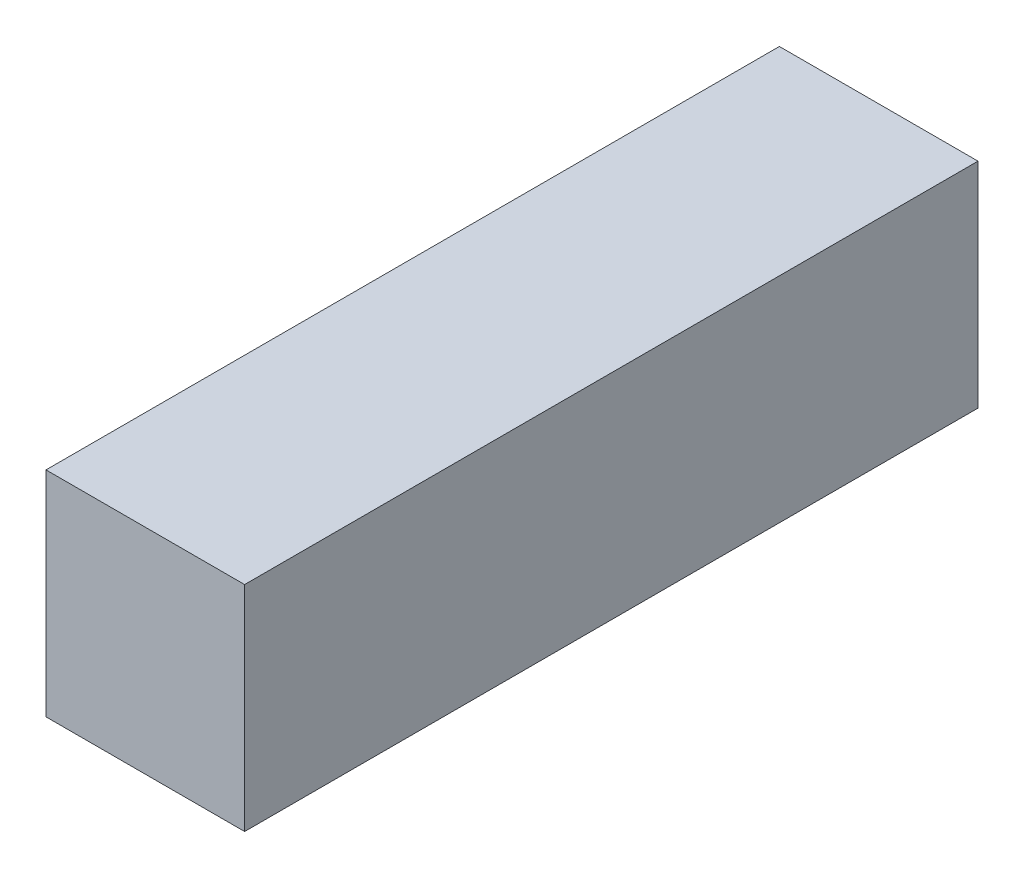
ISO-10303-21;
HEADER;
FILE_DESCRIPTION(('STEP AP214'),'2;1');
FILE_NAME('part.step','',(''),(''),'','','');
FILE_SCHEMA(('AUTOMOTIVE_DESIGN { 1 0 10303 214 1 1 1 1 }'));
ENDSEC;
DATA;
#1=APPLICATION_CONTEXT('core data for automotive mechanical design processes');
#2=APPLICATION_PROTOCOL_DEFINITION('international standard','automotive_design',2000,#1);
#3=PRODUCT_CONTEXT('',#1,'mechanical');
#4=PRODUCT('Part','Part','',(#3));
#5=PRODUCT_RELATED_PRODUCT_CATEGORY('part','',(#4));
#6=PRODUCT_DEFINITION_FORMATION('','',#4);
#7=PRODUCT_DEFINITION_CONTEXT('part definition',#1,'design');
#8=PRODUCT_DEFINITION('design','',#6,#7);
#9=PRODUCT_DEFINITION_SHAPE('','',#8);
#10=(LENGTH_UNIT() NAMED_UNIT(*) SI_UNIT(.MILLI.,.METRE.));
#11=(NAMED_UNIT(*) PLANE_ANGLE_UNIT() SI_UNIT($,.RADIAN.));
#12=(NAMED_UNIT(*) SI_UNIT($,.STERADIAN.) SOLID_ANGLE_UNIT());
#13=UNCERTAINTY_MEASURE_WITH_UNIT(LENGTH_MEASURE(1.E-05),#10,'distance_accuracy_value','');
#14=(GEOMETRIC_REPRESENTATION_CONTEXT(3) GLOBAL_UNCERTAINTY_ASSIGNED_CONTEXT((#13)) GLOBAL_UNIT_ASSIGNED_CONTEXT((#10,
#11,#12)) REPRESENTATION_CONTEXT('',''));
#15=CARTESIAN_POINT('',(0.,0.,0.));
#16=DIRECTION('',(0.,0.,1.));
#17=DIRECTION('',(1.,0.,0.));
#18=AXIS2_PLACEMENT_3D('',#15,#16,#17);
#19=CARTESIAN_POINT('',(0.,0.,152.4));
#20=DIRECTION('',(1.,0.,0.));
#21=DIRECTION('',(0.,0.,-1.));
#22=AXIS2_PLACEMENT_3D('',#19,#20,#21);
#23=PLANE('',#22);
#24=DIRECTION('',(0.,-1.,0.));
#25=VECTOR('',#24,1.);
#26=CARTESIAN_POINT('',(0.,0.,0.));
#27=LINE('',#26,#25);
#28=CARTESIAN_POINT('',(0.,44.45,0.));
#29=VERTEX_POINT('',#28);
#30=CARTESIAN_POINT('',(0.,0.,0.));
#31=VERTEX_POINT('',#30);
#32=EDGE_CURVE('E107',#29,#31,#27,.T.);
#33=ORIENTED_EDGE('',*,*,#32,.T.);
#34=DIRECTION('',(0.,0.,-1.));
#35=VECTOR('',#34,1.);
#36=CARTESIAN_POINT('',(0.,0.,152.4));
#37=LINE('',#36,#35);
#38=CARTESIAN_POINT('',(0.,0.,152.4));
#39=VERTEX_POINT('',#38);
#40=EDGE_CURVE('E11',#39,#31,#37,.T.);
#41=ORIENTED_EDGE('',*,*,#40,.F.);
#42=DIRECTION('',(0.,-1.,0.));
#43=VECTOR('',#42,1.);
#44=CARTESIAN_POINT('',(0.,0.,152.4));
#45=LINE('',#44,#43);
#46=CARTESIAN_POINT('',(0.,44.45,152.4));
#47=VERTEX_POINT('',#46);
#48=EDGE_CURVE('E91',#47,#39,#45,.T.);
#49=ORIENTED_EDGE('',*,*,#48,.F.);
#50=DIRECTION('',(0.,0.,-1.));
#51=VECTOR('',#50,1.);
#52=CARTESIAN_POINT('',(0.,44.45,152.4));
#53=LINE('',#52,#51);
#54=EDGE_CURVE('E103',#47,#29,#53,.T.);
#55=ORIENTED_EDGE('',*,*,#54,.T.);
#56=EDGE_LOOP('',(#33,#41,#49,#55));
#57=FACE_BOUND('',#56,.T.);
#58=ADVANCED_FACE('F39',(#57),#23,.F.);
#59=CARTESIAN_POINT('',(0.,0.,152.4));
#60=DIRECTION('',(0.,1.,0.));
#61=DIRECTION('',(0.,0.,1.));
#62=AXIS2_PLACEMENT_3D('',#59,#60,#61);
#63=PLANE('',#62);
#64=DIRECTION('',(1.,0.,0.));
#65=VECTOR('',#64,1.);
#66=CARTESIAN_POINT('',(0.,0.,0.));
#67=LINE('',#66,#65);
#68=CARTESIAN_POINT('',(41.275,0.,0.));
#69=VERTEX_POINT('',#68);
#70=EDGE_CURVE('E96',#31,#69,#67,.T.);
#71=ORIENTED_EDGE('',*,*,#70,.T.);
#72=DIRECTION('',(0.,0.,-1.));
#73=VECTOR('',#72,1.);
#74=CARTESIAN_POINT('',(41.275,0.,152.4));
#75=LINE('',#74,#73);
#76=CARTESIAN_POINT('',(41.275,0.,152.4));
#77=VERTEX_POINT('',#76);
#78=EDGE_CURVE('E48',#77,#69,#75,.T.);
#79=ORIENTED_EDGE('',*,*,#78,.F.);
#80=DIRECTION('',(1.,0.,0.));
#81=VECTOR('',#80,1.);
#82=CARTESIAN_POINT('',(0.,0.,152.4));
#83=LINE('',#82,#81);
#84=EDGE_CURVE('E86',#39,#77,#83,.T.);
#85=ORIENTED_EDGE('',*,*,#84,.F.);
#86=ORIENTED_EDGE('',*,*,#40,.T.);
#87=EDGE_LOOP('',(#71,#79,#85,#86));
#88=FACE_BOUND('',#87,.T.);
#89=ADVANCED_FACE('F95',(#88),#63,.F.);
#90=CARTESIAN_POINT('',(41.275,0.,152.4));
#91=DIRECTION('',(-1.,0.,0.));
#92=DIRECTION('',(0.,0.,1.));
#93=AXIS2_PLACEMENT_3D('',#90,#91,#92);
#94=PLANE('',#93);
#95=DIRECTION('',(0.,1.,0.));
#96=VECTOR('',#95,1.);
#97=CARTESIAN_POINT('',(41.275,0.,0.));
#98=LINE('',#97,#96);
#99=CARTESIAN_POINT('',(41.275,44.45,0.));
#100=VERTEX_POINT('',#99);
#101=EDGE_CURVE('E73',#69,#100,#98,.T.);
#102=ORIENTED_EDGE('',*,*,#101,.T.);
#103=DIRECTION('',(0.,0.,-1.));
#104=VECTOR('',#103,1.);
#105=CARTESIAN_POINT('',(41.275,44.45,152.4));
#106=LINE('',#105,#104);
#107=CARTESIAN_POINT('',(41.275,44.45,152.4));
#108=VERTEX_POINT('',#107);
#109=EDGE_CURVE('E98',#108,#100,#106,.T.);
#110=ORIENTED_EDGE('',*,*,#109,.F.);
#111=DIRECTION('',(0.,1.,0.));
#112=VECTOR('',#111,1.);
#113=CARTESIAN_POINT('',(41.275,0.,152.4));
#114=LINE('',#113,#112);
#115=EDGE_CURVE('E89',#77,#108,#114,.T.);
#116=ORIENTED_EDGE('',*,*,#115,.F.);
#117=ORIENTED_EDGE('',*,*,#78,.T.);
#118=EDGE_LOOP('',(#102,#110,#116,#117));
#119=FACE_BOUND('',#118,.T.);
#120=ADVANCED_FACE('F99',(#119),#94,.F.);
#121=CARTESIAN_POINT('',(0.,44.45,152.4));
#122=DIRECTION('',(0.,-1.,0.));
#123=DIRECTION('',(0.,0.,-1.));
#124=AXIS2_PLACEMENT_3D('',#121,#122,#123);
#125=PLANE('',#124);
#126=DIRECTION('',(-1.,0.,0.));
#127=VECTOR('',#126,1.);
#128=CARTESIAN_POINT('',(0.,44.45,0.));
#129=LINE('',#128,#127);
#130=EDGE_CURVE('E79',#100,#29,#129,.T.);
#131=ORIENTED_EDGE('',*,*,#130,.T.);
#132=ORIENTED_EDGE('',*,*,#54,.F.);
#133=DIRECTION('',(-1.,0.,0.));
#134=VECTOR('',#133,1.);
#135=CARTESIAN_POINT('',(0.,44.45,152.4));
#136=LINE('',#135,#134);
#137=EDGE_CURVE('E56',#108,#47,#136,.T.);
#138=ORIENTED_EDGE('',*,*,#137,.F.);
#139=ORIENTED_EDGE('',*,*,#109,.T.);
#140=EDGE_LOOP('',(#131,#132,#138,#139));
#141=FACE_BOUND('',#140,.T.);
#142=ADVANCED_FACE('F120',(#141),#125,.F.);
#143=CARTESIAN_POINT('',(0.,0.,152.4));
#144=DIRECTION('',(0.,0.,-1.));
#145=DIRECTION('',(-1.,0.,0.));
#146=AXIS2_PLACEMENT_3D('',#143,#144,#145);
#147=PLANE('',#146);
#148=ORIENTED_EDGE('',*,*,#48,.T.);
#149=ORIENTED_EDGE('',*,*,#84,.T.);
#150=ORIENTED_EDGE('',*,*,#115,.T.);
#151=ORIENTED_EDGE('',*,*,#137,.T.);
#152=EDGE_LOOP('',(#148,#149,#150,#151));
#153=FACE_BOUND('',#152,.T.);
#154=ADVANCED_FACE('F87',(#153),#147,.F.);
#155=CARTESIAN_POINT('',(0.,0.,0.));
#156=DIRECTION('',(0.,0.,-1.));
#157=DIRECTION('',(-1.,0.,0.));
#158=AXIS2_PLACEMENT_3D('',#155,#156,#157);
#159=PLANE('',#158);
#160=ORIENTED_EDGE('',*,*,#32,.F.);
#161=ORIENTED_EDGE('',*,*,#130,.F.);
#162=ORIENTED_EDGE('',*,*,#101,.F.);
#163=ORIENTED_EDGE('',*,*,#70,.F.);
#164=EDGE_LOOP('',(#160,#161,#162,#163));
#165=FACE_BOUND('',#164,.T.);
#166=ADVANCED_FACE('F123',(#165),#159,.T.);
#167=CLOSED_SHELL('',(#58,#89,#120,#142,#154,#166));
#168=MANIFOLD_SOLID_BREP('B2',#167);
#169=ADVANCED_BREP_SHAPE_REPRESENTATION('',(#18,#168),#14);
#170=SHAPE_DEFINITION_REPRESENTATION(#9,#169);
ENDSEC;
END-ISO-10303-21;
